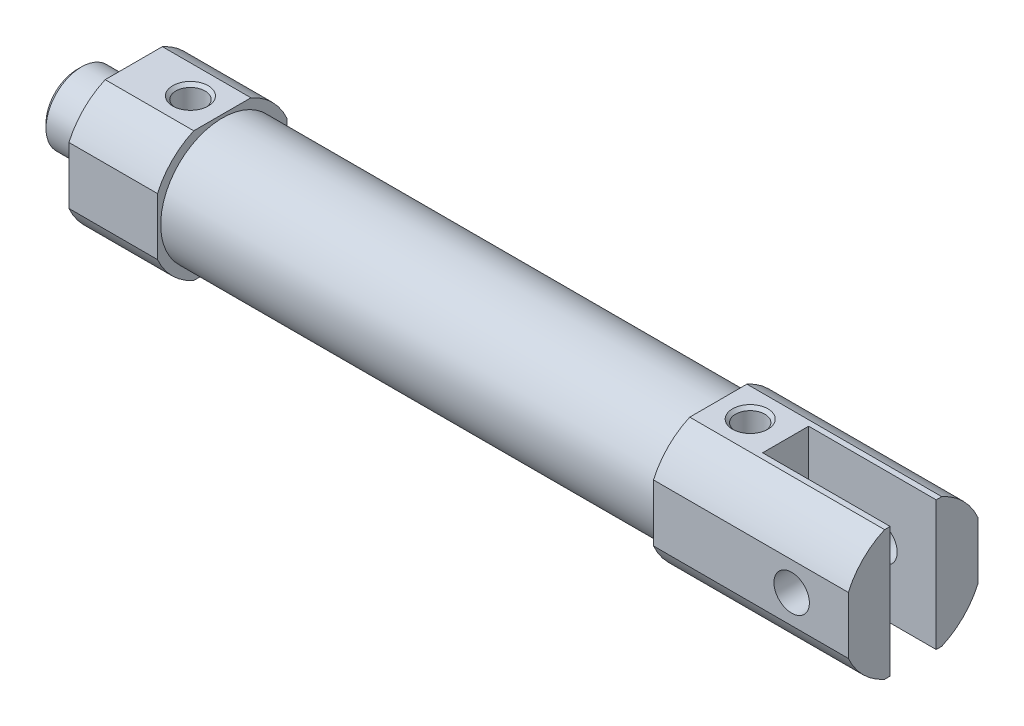
ISO-10303-21;
HEADER;
FILE_DESCRIPTION(('STEP AP214'),'2;1');
FILE_NAME('part.step','',(''),(''),'','','');
FILE_SCHEMA(('AUTOMOTIVE_DESIGN { 1 0 10303 214 1 1 1 1 }'));
ENDSEC;
DATA;
#1=APPLICATION_CONTEXT('core data for automotive mechanical design processes');
#2=APPLICATION_PROTOCOL_DEFINITION('international standard','automotive_design',2000,#1);
#3=PRODUCT_CONTEXT('',#1,'mechanical');
#4=PRODUCT('Part','Part','',(#3));
#5=PRODUCT_RELATED_PRODUCT_CATEGORY('part','',(#4));
#6=PRODUCT_DEFINITION_FORMATION('','',#4);
#7=PRODUCT_DEFINITION_CONTEXT('part definition',#1,'design');
#8=PRODUCT_DEFINITION('design','',#6,#7);
#9=PRODUCT_DEFINITION_SHAPE('','',#8);
#10=(LENGTH_UNIT() NAMED_UNIT(*) SI_UNIT(.MILLI.,.METRE.));
#11=(NAMED_UNIT(*) PLANE_ANGLE_UNIT() SI_UNIT($,.RADIAN.));
#12=(NAMED_UNIT(*) SI_UNIT($,.STERADIAN.) SOLID_ANGLE_UNIT());
#13=UNCERTAINTY_MEASURE_WITH_UNIT(LENGTH_MEASURE(1.E-05),#10,'distance_accuracy_value','');
#14=(GEOMETRIC_REPRESENTATION_CONTEXT(3) GLOBAL_UNCERTAINTY_ASSIGNED_CONTEXT((#13)) GLOBAL_UNIT_ASSIGNED_CONTEXT((#10,
#11,#12)) REPRESENTATION_CONTEXT('',''));
#15=CARTESIAN_POINT('',(0.,0.,0.));
#16=DIRECTION('',(0.,0.,1.));
#17=DIRECTION('',(1.,0.,0.));
#18=AXIS2_PLACEMENT_3D('',#15,#16,#17);
#19=CARTESIAN_POINT('',(82.5,-9.15,-4.0345383874738));
#20=DIRECTION('',(0.,-1.,0.));
#21=DIRECTION('',(1.,0.,0.));
#22=AXIS2_PLACEMENT_3D('',#19,#20,#21);
#23=PLANE('',#22);
#24=DIRECTION('',(1.,0.,0.));
#25=VECTOR('',#24,1.);
#26=CARTESIAN_POINT('',(92.,-9.15,3.25));
#27=LINE('',#26,#25);
#28=CARTESIAN_POINT('',(92.,-9.15,3.25));
#29=VERTEX_POINT('',#28);
#30=CARTESIAN_POINT('',(110.,-9.15,3.25));
#31=VERTEX_POINT('',#30);
#32=EDGE_CURVE('E157',#29,#31,#27,.T.);
#33=ORIENTED_EDGE('',*,*,#32,.T.);
#34=DIRECTION('',(0.,0.,1.));
#35=VECTOR('',#34,1.);
#36=CARTESIAN_POINT('',(110.,-9.15,3.25));
#37=LINE('',#36,#35);
#38=CARTESIAN_POINT('',(110.,-9.15,4.03453838747381));
#39=VERTEX_POINT('',#38);
#40=EDGE_CURVE('E172',#39,#31,#37,.F.);
#41=ORIENTED_EDGE('',*,*,#40,.F.);
#42=DIRECTION('',(-1.,0.,0.));
#43=VECTOR('',#42,1.);
#44=CARTESIAN_POINT('',(110.,-9.15,4.03453838747381));
#45=LINE('',#44,#43);
#46=CARTESIAN_POINT('',(82.5,-9.15,4.03453838747381));
#47=VERTEX_POINT('',#46);
#48=EDGE_CURVE('E181',#39,#47,#45,.T.);
#49=ORIENTED_EDGE('',*,*,#48,.T.);
#50=DIRECTION('',(0.,0.,-1.));
#51=VECTOR('',#50,1.);
#52=CARTESIAN_POINT('',(82.5,-9.15,4.03453838747381));
#53=LINE('',#52,#51);
#54=CARTESIAN_POINT('',(82.5,-9.15,-4.0345383874738));
#55=VERTEX_POINT('',#54);
#56=EDGE_CURVE('E183',#47,#55,#53,.T.);
#57=ORIENTED_EDGE('',*,*,#56,.T.);
#58=DIRECTION('',(1.,0.,0.));
#59=VECTOR('',#58,1.);
#60=CARTESIAN_POINT('',(82.5,-9.15,-4.0345383874738));
#61=LINE('',#60,#59);
#62=CARTESIAN_POINT('',(110.,-9.15,-4.0345383874738));
#63=VERTEX_POINT('',#62);
#64=EDGE_CURVE('E194',#63,#55,#61,.F.);
#65=ORIENTED_EDGE('',*,*,#64,.F.);
#66=DIRECTION('',(0.,0.,1.));
#67=VECTOR('',#66,1.);
#68=CARTESIAN_POINT('',(110.,-9.15,-4.0345383874738));
#69=LINE('',#68,#67);
#70=CARTESIAN_POINT('',(110.,-9.15,-3.25));
#71=VERTEX_POINT('',#70);
#72=EDGE_CURVE('E199',#71,#63,#69,.F.);
#73=ORIENTED_EDGE('',*,*,#72,.F.);
#74=DIRECTION('',(-1.,0.,0.));
#75=VECTOR('',#74,1.);
#76=CARTESIAN_POINT('',(110.,-9.15,-3.25));
#77=LINE('',#76,#75);
#78=CARTESIAN_POINT('',(92.,-9.15,-3.25));
#79=VERTEX_POINT('',#78);
#80=EDGE_CURVE('E204',#71,#79,#77,.T.);
#81=ORIENTED_EDGE('',*,*,#80,.T.);
#82=DIRECTION('',(0.,0.,1.));
#83=VECTOR('',#82,1.);
#84=CARTESIAN_POINT('',(92.,-9.15,-3.25));
#85=LINE('',#84,#83);
#86=EDGE_CURVE('E175',#79,#29,#85,.T.);
#87=ORIENTED_EDGE('',*,*,#86,.T.);
#88=EDGE_LOOP('',(#33,#41,#49,#57,#65,#73,#81,#87));
#89=FACE_BOUND('',#88,.T.);
#90=ADVANCED_FACE('F17',(#89),#23,.T.);
#91=CARTESIAN_POINT('',(82.5,9.15,4.0345383874738));
#92=DIRECTION('',(0.,1.,0.));
#93=DIRECTION('',(1.,0.,0.));
#94=AXIS2_PLACEMENT_3D('',#91,#92,#93);
#95=PLANE('',#94);
#96=DIRECTION('',(-1.,0.,0.));
#97=VECTOR('',#96,1.);
#98=CARTESIAN_POINT('',(110.,9.15,3.25));
#99=LINE('',#98,#97);
#100=CARTESIAN_POINT('',(92.,9.15,3.25));
#101=VERTEX_POINT('',#100);
#102=CARTESIAN_POINT('',(110.,9.15,3.25));
#103=VERTEX_POINT('',#102);
#104=EDGE_CURVE('E160',#101,#103,#99,.F.);
#105=ORIENTED_EDGE('',*,*,#104,.F.);
#106=DIRECTION('',(0.,0.,-1.));
#107=VECTOR('',#106,1.);
#108=CARTESIAN_POINT('',(92.,9.15,3.25));
#109=LINE('',#108,#107);
#110=CARTESIAN_POINT('',(92.,9.15,-3.25));
#111=VERTEX_POINT('',#110);
#112=EDGE_CURVE('E214',#111,#101,#109,.F.);
#113=ORIENTED_EDGE('',*,*,#112,.F.);
#114=DIRECTION('',(1.,0.,0.));
#115=VECTOR('',#114,1.);
#116=CARTESIAN_POINT('',(92.,9.15,-3.25));
#117=LINE('',#116,#115);
#118=CARTESIAN_POINT('',(110.,9.15,-3.25));
#119=VERTEX_POINT('',#118);
#120=EDGE_CURVE('E219',#119,#111,#117,.F.);
#121=ORIENTED_EDGE('',*,*,#120,.F.);
#122=DIRECTION('',(0.,0.,-1.));
#123=VECTOR('',#122,1.);
#124=CARTESIAN_POINT('',(110.,9.15,-3.25));
#125=LINE('',#124,#123);
#126=CARTESIAN_POINT('',(110.,9.15,-4.0345383874738));
#127=VERTEX_POINT('',#126);
#128=EDGE_CURVE('E223',#127,#119,#125,.F.);
#129=ORIENTED_EDGE('',*,*,#128,.F.);
#130=DIRECTION('',(-1.,0.,0.));
#131=VECTOR('',#130,1.);
#132=CARTESIAN_POINT('',(110.,9.15,-4.0345383874738));
#133=LINE('',#132,#131);
#134=CARTESIAN_POINT('',(82.5,9.15,-4.0345383874738));
#135=VERTEX_POINT('',#134);
#136=EDGE_CURVE('E228',#127,#135,#133,.T.);
#137=ORIENTED_EDGE('',*,*,#136,.T.);
#138=DIRECTION('',(0.,0.,1.));
#139=VECTOR('',#138,1.);
#140=CARTESIAN_POINT('',(82.5,9.15,-4.0345383874738));
#141=LINE('',#140,#139);
#142=CARTESIAN_POINT('',(82.5,9.15,4.0345383874738));
#143=VERTEX_POINT('',#142);
#144=EDGE_CURVE('E233',#135,#143,#141,.T.);
#145=ORIENTED_EDGE('',*,*,#144,.T.);
#146=DIRECTION('',(1.,0.,0.));
#147=VECTOR('',#146,1.);
#148=CARTESIAN_POINT('',(82.5,9.15,4.0345383874738));
#149=LINE('',#148,#147);
#150=CARTESIAN_POINT('',(110.,9.15,4.0345383874738));
#151=VERTEX_POINT('',#150);
#152=EDGE_CURVE('E238',#151,#143,#149,.F.);
#153=ORIENTED_EDGE('',*,*,#152,.F.);
#154=DIRECTION('',(0.,0.,-1.));
#155=VECTOR('',#154,1.);
#156=CARTESIAN_POINT('',(110.,9.15,4.0345383874738));
#157=LINE('',#156,#155);
#158=EDGE_CURVE('E243',#103,#151,#157,.F.);
#159=ORIENTED_EDGE('',*,*,#158,.F.);
#160=EDGE_LOOP('',(#105,#113,#121,#129,#137,#145,#153,#159));
#161=FACE_BOUND('',#160,.T.);
#162=CARTESIAN_POINT('',(87.,9.15,0.));
#163=DIRECTION('',(0.,-1.,0.));
#164=DIRECTION('',(0.,0.,1.));
#165=AXIS2_PLACEMENT_3D('',#162,#163,#164);
#166=CIRCLE('',#165,2.5);
#167=CARTESIAN_POINT('',(87.,9.15,2.5));
#168=VERTEX_POINT('',#167);
#169=EDGE_CURVE('E166',#168,#168,#166,.F.);
#170=ORIENTED_EDGE('',*,*,#169,.F.);
#171=EDGE_LOOP('',(#170));
#172=FACE_BOUND('',#171,.T.);
#173=ADVANCED_FACE('F522',(#161,#172),#95,.T.);
#174=CARTESIAN_POINT('',(110.,-9.15,9.15000000000001));
#175=DIRECTION('',(1.,0.,0.));
#176=DIRECTION('',(0.,0.,-1.));
#177=AXIS2_PLACEMENT_3D('',#174,#175,#176);
#178=PLANE('',#177);
#179=ORIENTED_EDGE('',*,*,#40,.T.);
#180=DIRECTION('',(0.,1.,0.));
#181=VECTOR('',#180,1.);
#182=CARTESIAN_POINT('',(110.,-9.15,3.25));
#183=LINE('',#182,#181);
#184=EDGE_CURVE('E153',#103,#31,#183,.F.);
#185=ORIENTED_EDGE('',*,*,#184,.F.);
#186=ORIENTED_EDGE('',*,*,#158,.T.);
#187=CARTESIAN_POINT('',(110.,5.30825383648903E-13,5.31692745386891E-13));
#188=DIRECTION('',(1.,0.,0.));
#189=DIRECTION('',(0.,0.915000000000012,0.403453838747356));
#190=AXIS2_PLACEMENT_3D('',#187,#188,#189);
#191=CIRCLE('',#190,9.99999999999929);
#192=CARTESIAN_POINT('',(110.,4.0345383874738,9.15000000000001));
#193=VERTEX_POINT('',#192);
#194=EDGE_CURVE('E165',#151,#193,#191,.T.);
#195=ORIENTED_EDGE('',*,*,#194,.T.);
#196=DIRECTION('',(0.,-1.,0.));
#197=VECTOR('',#196,1.);
#198=CARTESIAN_POINT('',(110.,4.0345383874738,9.15));
#199=LINE('',#198,#197);
#200=CARTESIAN_POINT('',(110.,-4.0345383874738,9.15000000000001));
#201=VERTEX_POINT('',#200);
#202=EDGE_CURVE('E255',#193,#201,#199,.T.);
#203=ORIENTED_EDGE('',*,*,#202,.T.);
#204=CARTESIAN_POINT('',(110.,-5.31692745386891E-13,5.30825383648903E-13));
#205=DIRECTION('',(1.,0.,0.));
#206=DIRECTION('',(0.,-0.403453838747355,0.915000000000013));
#207=AXIS2_PLACEMENT_3D('',#204,#205,#206);
#208=CIRCLE('',#207,9.99999999999929);
#209=EDGE_CURVE('E180',#201,#39,#208,.T.);
#210=ORIENTED_EDGE('',*,*,#209,.T.);
#211=EDGE_LOOP('',(#179,#185,#186,#195,#203,#210));
#212=FACE_BOUND('',#211,.T.);
#213=ADVANCED_FACE('F178',(#212),#178,.T.);
#214=CARTESIAN_POINT('',(110.,-9.15000000000001,-3.25));
#215=DIRECTION('',(1.,0.,0.));
#216=DIRECTION('',(0.,0.,-1.));
#217=AXIS2_PLACEMENT_3D('',#214,#215,#216);
#218=PLANE('',#217);
#219=ORIENTED_EDGE('',*,*,#128,.T.);
#220=DIRECTION('',(0.,-1.,0.));
#221=VECTOR('',#220,1.);
#222=CARTESIAN_POINT('',(110.,9.15,-3.25));
#223=LINE('',#222,#221);
#224=EDGE_CURVE('E262',#119,#71,#223,.T.);
#225=ORIENTED_EDGE('',*,*,#224,.T.);
#226=ORIENTED_EDGE('',*,*,#72,.T.);
#227=CARTESIAN_POINT('',(110.,-5.30825383648903E-13,-5.31692745386891E-13));
#228=DIRECTION('',(1.,0.,0.));
#229=DIRECTION('',(0.,-0.915000000000013,-0.403453838747355));
#230=AXIS2_PLACEMENT_3D('',#227,#228,#229);
#231=CIRCLE('',#230,9.99999999999929);
#232=CARTESIAN_POINT('',(110.,-4.03453838747381,-9.15));
#233=VERTEX_POINT('',#232);
#234=EDGE_CURVE('E267',#63,#233,#231,.T.);
#235=ORIENTED_EDGE('',*,*,#234,.T.);
#236=DIRECTION('',(0.,1.,0.));
#237=VECTOR('',#236,1.);
#238=CARTESIAN_POINT('',(110.,-4.03453838747381,-9.15));
#239=LINE('',#238,#237);
#240=CARTESIAN_POINT('',(110.,4.0345383874738,-9.15000000000001));
#241=VERTEX_POINT('',#240);
#242=EDGE_CURVE('E272',#233,#241,#239,.T.);
#243=ORIENTED_EDGE('',*,*,#242,.T.);
#244=CARTESIAN_POINT('',(110.,5.31692745386891E-13,-5.30825383648903E-13));
#245=DIRECTION('',(1.,0.,0.));
#246=DIRECTION('',(0.,0.403453838747355,-0.915000000000012));
#247=AXIS2_PLACEMENT_3D('',#244,#245,#246);
#248=CIRCLE('',#247,9.99999999999929);
#249=EDGE_CURVE('E277',#241,#127,#248,.T.);
#250=ORIENTED_EDGE('',*,*,#249,.T.);
#251=EDGE_LOOP('',(#219,#225,#226,#235,#243,#250));
#252=FACE_BOUND('',#251,.T.);
#253=ADVANCED_FACE('F532',(#252),#218,.T.);
#254=CARTESIAN_POINT('',(-8.,-4.3865,4.3865));
#255=DIRECTION('',(-1.,0.,0.));
#256=DIRECTION('',(0.,1.,0.));
#257=AXIS2_PLACEMENT_3D('',#254,#255,#256);
#258=PLANE('',#257);
#259=CARTESIAN_POINT('',(-8.,0.,0.));
#260=DIRECTION('',(-1.,0.,0.));
#261=DIRECTION('',(0.,0.,-1.));
#262=AXIS2_PLACEMENT_3D('',#259,#260,#261);
#263=CIRCLE('',#262,4.3865);
#264=CARTESIAN_POINT('',(-8.,0.,-4.3865));
#265=VERTEX_POINT('',#264);
#266=EDGE_CURVE('E282',#265,#265,#263,.F.);
#267=ORIENTED_EDGE('',*,*,#266,.F.);
#268=EDGE_LOOP('',(#267));
#269=FACE_BOUND('',#268,.T.);
#270=CARTESIAN_POINT('',(-8.,0.,0.));
#271=DIRECTION('',(1.,0.,0.));
#272=DIRECTION('',(0.,-1.420539007313E-07,0.99999999999999));
#273=AXIS2_PLACEMENT_3D('',#270,#271,#272);
#274=CIRCLE('',#273,2.5);
#275=CARTESIAN_POINT('',(-8.,-3.55134751828251E-07,2.49999999999997));
#276=VERTEX_POINT('',#275);
#277=EDGE_CURVE('E287',#276,#276,#274,.T.);
#278=ORIENTED_EDGE('',*,*,#277,.T.);
#279=EDGE_LOOP('',(#278));
#280=FACE_BOUND('',#279,.T.);
#281=ADVANCED_FACE('F535',(#269,#280),#258,.T.);
#282=CARTESIAN_POINT('',(12.5,5.30825383648903E-13,5.31692745386891E-13));
#283=DIRECTION('',(-1.,0.,0.));
#284=DIRECTION('',(0.,0.403453838747356,0.915000000000012));
#285=AXIS2_PLACEMENT_3D('',#282,#283,#284);
#286=CYLINDRICAL_SURFACE('',#285,9.99999999999929);
#287=CARTESIAN_POINT('',(0.,5.30825383648903E-13,5.31692745386891E-13));
#288=DIRECTION('',(1.,0.,0.));
#289=DIRECTION('',(0.,0.915000000000012,0.403453838747356));
#290=AXIS2_PLACEMENT_3D('',#287,#288,#289);
#291=CIRCLE('',#290,9.99999999999929);
#292=CARTESIAN_POINT('',(0.,9.15000000000001,4.0345383874738));
#293=VERTEX_POINT('',#292);
#294=CARTESIAN_POINT('',(0.,4.03453838747381,9.15000000000001));
#295=VERTEX_POINT('',#294);
#296=EDGE_CURVE('E290',#293,#295,#291,.T.);
#297=ORIENTED_EDGE('',*,*,#296,.T.);
#298=DIRECTION('',(1.,0.,0.));
#299=VECTOR('',#298,1.);
#300=CARTESIAN_POINT('',(0.,4.03453838747381,9.15000000000001));
#301=LINE('',#300,#299);
#302=CARTESIAN_POINT('',(12.5,4.03453838747381,9.15000000000001));
#303=VERTEX_POINT('',#302);
#304=EDGE_CURVE('E293',#303,#295,#301,.F.);
#305=ORIENTED_EDGE('',*,*,#304,.F.);
#306=CARTESIAN_POINT('',(12.5,5.30825383648903E-13,5.31692745386891E-13));
#307=DIRECTION('',(-1.,0.,0.));
#308=DIRECTION('',(0.,0.403453838747356,0.915000000000012));
#309=AXIS2_PLACEMENT_3D('',#306,#307,#308);
#310=CIRCLE('',#309,9.99999999999929);
#311=CARTESIAN_POINT('',(12.5,9.15000000000001,4.0345383874738));
#312=VERTEX_POINT('',#311);
#313=EDGE_CURVE('E298',#312,#303,#310,.F.);
#314=ORIENTED_EDGE('',*,*,#313,.F.);
#315=DIRECTION('',(-1.,0.,0.));
#316=VECTOR('',#315,1.);
#317=CARTESIAN_POINT('',(12.5,9.15000000000001,4.0345383874738));
#318=LINE('',#317,#316);
#319=EDGE_CURVE('E302',#312,#293,#318,.T.);
#320=ORIENTED_EDGE('',*,*,#319,.T.);
#321=EDGE_LOOP('',(#297,#305,#314,#320));
#322=FACE_BOUND('',#321,.T.);
#323=ADVANCED_FACE('F539',(#322),#286,.T.);
#324=CARTESIAN_POINT('',(12.5,-4.0345383874738,9.15));
#325=DIRECTION('',(0.,0.,1.));
#326=DIRECTION('',(0.,1.,0.));
#327=AXIS2_PLACEMENT_3D('',#324,#325,#326);
#328=PLANE('',#327);
#329=DIRECTION('',(0.,-1.,0.));
#330=VECTOR('',#329,1.);
#331=CARTESIAN_POINT('',(0.,4.0345383874738,9.15));
#332=LINE('',#331,#330);
#333=CARTESIAN_POINT('',(0.,-4.0345383874738,9.15));
#334=VERTEX_POINT('',#333);
#335=EDGE_CURVE('E307',#295,#334,#332,.T.);
#336=ORIENTED_EDGE('',*,*,#335,.T.);
#337=DIRECTION('',(1.,0.,0.));
#338=VECTOR('',#337,1.);
#339=CARTESIAN_POINT('',(0.,-4.0345383874738,9.15));
#340=LINE('',#339,#338);
#341=CARTESIAN_POINT('',(12.5,-4.0345383874738,9.15));
#342=VERTEX_POINT('',#341);
#343=EDGE_CURVE('E312',#342,#334,#340,.F.);
#344=ORIENTED_EDGE('',*,*,#343,.F.);
#345=DIRECTION('',(0.,1.,0.));
#346=VECTOR('',#345,1.);
#347=CARTESIAN_POINT('',(12.5,-4.0345383874738,9.15));
#348=LINE('',#347,#346);
#349=EDGE_CURVE('E317',#303,#342,#348,.F.);
#350=ORIENTED_EDGE('',*,*,#349,.F.);
#351=ORIENTED_EDGE('',*,*,#304,.T.);
#352=EDGE_LOOP('',(#336,#344,#350,#351));
#353=FACE_BOUND('',#352,.T.);
#354=ADVANCED_FACE('F543',(#353),#328,.T.);
#355=CARTESIAN_POINT('',(12.5,-5.31692745386891E-13,5.30825383648903E-13));
#356=DIRECTION('',(-1.,0.,0.));
#357=DIRECTION('',(0.,-0.915000000000013,0.403453838747355));
#358=AXIS2_PLACEMENT_3D('',#355,#356,#357);
#359=CYLINDRICAL_SURFACE('',#358,9.99999999999929);
#360=CARTESIAN_POINT('',(0.,-5.31692745386891E-13,5.30825383648903E-13));
#361=DIRECTION('',(1.,0.,0.));
#362=DIRECTION('',(0.,-0.403453838747356,0.915000000000012));
#363=AXIS2_PLACEMENT_3D('',#360,#361,#362);
#364=CIRCLE('',#363,9.99999999999929);
#365=CARTESIAN_POINT('',(0.,-9.15000000000001,4.0345383874738));
#366=VERTEX_POINT('',#365);
#367=EDGE_CURVE('E321',#334,#366,#364,.T.);
#368=ORIENTED_EDGE('',*,*,#367,.T.);
#369=DIRECTION('',(1.,0.,0.));
#370=VECTOR('',#369,1.);
#371=CARTESIAN_POINT('',(0.,-9.15000000000001,4.03453838747381));
#372=LINE('',#371,#370);
#373=CARTESIAN_POINT('',(12.5,-9.15000000000001,4.03453838747381));
#374=VERTEX_POINT('',#373);
#375=EDGE_CURVE('E326',#374,#366,#372,.F.);
#376=ORIENTED_EDGE('',*,*,#375,.F.);
#377=CARTESIAN_POINT('',(12.5,-5.31692745386891E-13,5.30825383648903E-13));
#378=DIRECTION('',(-1.,0.,0.));
#379=DIRECTION('',(0.,-0.915000000000012,0.403453838747357));
#380=AXIS2_PLACEMENT_3D('',#377,#378,#379);
#381=CIRCLE('',#380,9.99999999999929);
#382=EDGE_CURVE('E331',#342,#374,#381,.F.);
#383=ORIENTED_EDGE('',*,*,#382,.F.);
#384=ORIENTED_EDGE('',*,*,#343,.T.);
#385=EDGE_LOOP('',(#368,#376,#383,#384));
#386=FACE_BOUND('',#385,.T.);
#387=ADVANCED_FACE('F547',(#386),#359,.T.);
#388=CARTESIAN_POINT('',(0.,-9.15,-4.0345383874738));
#389=DIRECTION('',(0.,-1.,0.));
#390=DIRECTION('',(1.,0.,0.));
#391=AXIS2_PLACEMENT_3D('',#388,#389,#390);
#392=PLANE('',#391);
#393=DIRECTION('',(0.,0.,-1.));
#394=VECTOR('',#393,1.);
#395=CARTESIAN_POINT('',(0.,-9.15,4.03453838747381));
#396=LINE('',#395,#394);
#397=CARTESIAN_POINT('',(0.,-9.15,-4.0345383874738));
#398=VERTEX_POINT('',#397);
#399=EDGE_CURVE('E335',#366,#398,#396,.T.);
#400=ORIENTED_EDGE('',*,*,#399,.T.);
#401=DIRECTION('',(1.,0.,0.));
#402=VECTOR('',#401,1.);
#403=CARTESIAN_POINT('',(0.,-9.15,-4.0345383874738));
#404=LINE('',#403,#402);
#405=CARTESIAN_POINT('',(12.5,-9.15,-4.0345383874738));
#406=VERTEX_POINT('',#405);
#407=EDGE_CURVE('E340',#406,#398,#404,.F.);
#408=ORIENTED_EDGE('',*,*,#407,.F.);
#409=DIRECTION('',(0.,0.,1.));
#410=VECTOR('',#409,1.);
#411=CARTESIAN_POINT('',(12.5,-9.15,-4.0345383874738));
#412=LINE('',#411,#410);
#413=EDGE_CURVE('E345',#374,#406,#412,.F.);
#414=ORIENTED_EDGE('',*,*,#413,.F.);
#415=ORIENTED_EDGE('',*,*,#375,.T.);
#416=EDGE_LOOP('',(#400,#408,#414,#415));
#417=FACE_BOUND('',#416,.T.);
#418=ADVANCED_FACE('F551',(#417),#392,.T.);
#419=CARTESIAN_POINT('',(12.5,-5.30825383648903E-13,-5.31692745386891E-13));
#420=DIRECTION('',(-1.,0.,0.));
#421=DIRECTION('',(0.,-0.403453838747356,-0.915000000000012));
#422=AXIS2_PLACEMENT_3D('',#419,#420,#421);
#423=CYLINDRICAL_SURFACE('',#422,9.99999999999929);
#424=CARTESIAN_POINT('',(0.,-5.30825383648903E-13,-5.31692745386891E-13));
#425=DIRECTION('',(1.,0.,0.));
#426=DIRECTION('',(0.,-0.915000000000012,-0.403453838747356));
#427=AXIS2_PLACEMENT_3D('',#424,#425,#426);
#428=CIRCLE('',#427,9.99999999999929);
#429=CARTESIAN_POINT('',(0.,-4.03453838747381,-9.15000000000001));
#430=VERTEX_POINT('',#429);
#431=EDGE_CURVE('E349',#398,#430,#428,.T.);
#432=ORIENTED_EDGE('',*,*,#431,.T.);
#433=DIRECTION('',(1.,0.,0.));
#434=VECTOR('',#433,1.);
#435=CARTESIAN_POINT('',(0.,-4.03453838747381,-9.15));
#436=LINE('',#435,#434);
#437=CARTESIAN_POINT('',(12.5,-4.03453838747381,-9.15));
#438=VERTEX_POINT('',#437);
#439=EDGE_CURVE('E354',#438,#430,#436,.F.);
#440=ORIENTED_EDGE('',*,*,#439,.F.);
#441=CARTESIAN_POINT('',(12.5,-5.30825383648903E-13,-5.31692745386891E-13));
#442=DIRECTION('',(-1.,0.,0.));
#443=DIRECTION('',(0.,-0.403453838747356,-0.915000000000012));
#444=AXIS2_PLACEMENT_3D('',#441,#442,#443);
#445=CIRCLE('',#444,9.99999999999929);
#446=EDGE_CURVE('E359',#406,#438,#445,.F.);
#447=ORIENTED_EDGE('',*,*,#446,.F.);
#448=ORIENTED_EDGE('',*,*,#407,.T.);
#449=EDGE_LOOP('',(#432,#440,#447,#448));
#450=FACE_BOUND('',#449,.T.);
#451=ADVANCED_FACE('F555',(#450),#423,.T.);
#452=CARTESIAN_POINT('',(0.,-4.03453838747381,-9.15));
#453=DIRECTION('',(0.,0.,-1.));
#454=DIRECTION('',(0.,1.,0.));
#455=AXIS2_PLACEMENT_3D('',#452,#453,#454);
#456=PLANE('',#455);
#457=DIRECTION('',(0.,1.,0.));
#458=VECTOR('',#457,1.);
#459=CARTESIAN_POINT('',(0.,-4.03453838747381,-9.15));
#460=LINE('',#459,#458);
#461=CARTESIAN_POINT('',(0.,4.0345383874738,-9.15));
#462=VERTEX_POINT('',#461);
#463=EDGE_CURVE('E363',#430,#462,#460,.T.);
#464=ORIENTED_EDGE('',*,*,#463,.T.);
#465=DIRECTION('',(1.,0.,0.));
#466=VECTOR('',#465,1.);
#467=CARTESIAN_POINT('',(0.,4.0345383874738,-9.15));
#468=LINE('',#467,#466);
#469=CARTESIAN_POINT('',(12.5,4.0345383874738,-9.15));
#470=VERTEX_POINT('',#469);
#471=EDGE_CURVE('E368',#470,#462,#468,.F.);
#472=ORIENTED_EDGE('',*,*,#471,.F.);
#473=DIRECTION('',(0.,-1.,0.));
#474=VECTOR('',#473,1.);
#475=CARTESIAN_POINT('',(12.5,4.0345383874738,-9.15));
#476=LINE('',#475,#474);
#477=EDGE_CURVE('E373',#438,#470,#476,.F.);
#478=ORIENTED_EDGE('',*,*,#477,.F.);
#479=ORIENTED_EDGE('',*,*,#439,.T.);
#480=EDGE_LOOP('',(#464,#472,#478,#479));
#481=FACE_BOUND('',#480,.T.);
#482=ADVANCED_FACE('F559',(#481),#456,.T.);
#483=CARTESIAN_POINT('',(12.5,5.31692745386891E-13,-5.30825383648903E-13));
#484=DIRECTION('',(-1.,0.,0.));
#485=DIRECTION('',(0.,0.915000000000012,-0.403453838747356));
#486=AXIS2_PLACEMENT_3D('',#483,#484,#485);
#487=CYLINDRICAL_SURFACE('',#486,9.99999999999929);
#488=CARTESIAN_POINT('',(0.,5.31692745386891E-13,-5.30825383648903E-13));
#489=DIRECTION('',(1.,0.,0.));
#490=DIRECTION('',(0.,0.403453838747356,-0.915000000000012));
#491=AXIS2_PLACEMENT_3D('',#488,#489,#490);
#492=CIRCLE('',#491,9.99999999999929);
#493=CARTESIAN_POINT('',(0.,9.15000000000001,-4.03453838747381));
#494=VERTEX_POINT('',#493);
#495=EDGE_CURVE('E377',#462,#494,#492,.T.);
#496=ORIENTED_EDGE('',*,*,#495,.T.);
#497=DIRECTION('',(1.,0.,0.));
#498=VECTOR('',#497,1.);
#499=CARTESIAN_POINT('',(0.,9.15,-4.03453838747381));
#500=LINE('',#499,#498);
#501=CARTESIAN_POINT('',(12.5,9.15,-4.03453838747381));
#502=VERTEX_POINT('',#501);
#503=EDGE_CURVE('E382',#502,#494,#500,.F.);
#504=ORIENTED_EDGE('',*,*,#503,.F.);
#505=CARTESIAN_POINT('',(12.5,5.31692745386891E-13,-5.30825383648903E-13));
#506=DIRECTION('',(-1.,0.,0.));
#507=DIRECTION('',(0.,0.915000000000012,-0.403453838747356));
#508=AXIS2_PLACEMENT_3D('',#505,#506,#507);
#509=CIRCLE('',#508,9.99999999999929);
#510=EDGE_CURVE('E387',#470,#502,#509,.F.);
#511=ORIENTED_EDGE('',*,*,#510,.F.);
#512=ORIENTED_EDGE('',*,*,#471,.T.);
#513=EDGE_LOOP('',(#496,#504,#511,#512));
#514=FACE_BOUND('',#513,.T.);
#515=ADVANCED_FACE('F563',(#514),#487,.T.);
#516=CARTESIAN_POINT('',(0.,9.15,4.0345383874738));
#517=DIRECTION('',(0.,1.,0.));
#518=DIRECTION('',(1.,0.,0.));
#519=AXIS2_PLACEMENT_3D('',#516,#517,#518);
#520=PLANE('',#519);
#521=DIRECTION('',(0.,0.,1.));
#522=VECTOR('',#521,1.);
#523=CARTESIAN_POINT('',(0.,9.15,-4.0345383874738));
#524=LINE('',#523,#522);
#525=EDGE_CURVE('E391',#494,#293,#524,.T.);
#526=ORIENTED_EDGE('',*,*,#525,.T.);
#527=ORIENTED_EDGE('',*,*,#319,.F.);
#528=DIRECTION('',(0.,0.,-1.));
#529=VECTOR('',#528,1.);
#530=CARTESIAN_POINT('',(12.5,9.15,4.0345383874738));
#531=LINE('',#530,#529);
#532=EDGE_CURVE('E396',#502,#312,#531,.F.);
#533=ORIENTED_EDGE('',*,*,#532,.F.);
#534=ORIENTED_EDGE('',*,*,#503,.T.);
#535=EDGE_LOOP('',(#526,#527,#533,#534));
#536=FACE_BOUND('',#535,.T.);
#537=CARTESIAN_POINT('',(8.,9.15,0.));
#538=DIRECTION('',(0.,-1.,0.));
#539=DIRECTION('',(0.,0.,1.));
#540=AXIS2_PLACEMENT_3D('',#537,#538,#539);
#541=CIRCLE('',#540,2.5);
#542=CARTESIAN_POINT('',(8.,9.15,2.5));
#543=VERTEX_POINT('',#542);
#544=EDGE_CURVE('E400',#543,#543,#541,.F.);
#545=ORIENTED_EDGE('',*,*,#544,.F.);
#546=EDGE_LOOP('',(#545));
#547=FACE_BOUND('',#546,.T.);
#548=ADVANCED_FACE('F567',(#536,#547),#520,.T.);
#549=CARTESIAN_POINT('',(12.5,-9.15000000000001,9.15000000000001));
#550=DIRECTION('',(1.,0.,0.));
#551=DIRECTION('',(0.,0.,-1.));
#552=AXIS2_PLACEMENT_3D('',#549,#550,#551);
#553=PLANE('',#552);
#554=ORIENTED_EDGE('',*,*,#313,.T.);
#555=ORIENTED_EDGE('',*,*,#349,.T.);
#556=ORIENTED_EDGE('',*,*,#382,.T.);
#557=ORIENTED_EDGE('',*,*,#413,.T.);
#558=ORIENTED_EDGE('',*,*,#446,.T.);
#559=ORIENTED_EDGE('',*,*,#477,.T.);
#560=ORIENTED_EDGE('',*,*,#510,.T.);
#561=ORIENTED_EDGE('',*,*,#532,.T.);
#562=EDGE_LOOP('',(#554,#555,#556,#557,#558,#559,#560,#561));
#563=FACE_BOUND('',#562,.T.);
#564=CARTESIAN_POINT('',(12.5,0.,0.));
#565=DIRECTION('',(-1.,0.,0.));
#566=DIRECTION('',(0.,-1.16844485555755E-09,-1.));
#567=AXIS2_PLACEMENT_3D('',#564,#565,#566);
#568=CIRCLE('',#567,8.7);
#569=CARTESIAN_POINT('',(12.5,-1.01654702433507E-08,-8.7));
#570=VERTEX_POINT('',#569);
#571=EDGE_CURVE('E405',#570,#570,#568,.F.);
#572=ORIENTED_EDGE('',*,*,#571,.F.);
#573=EDGE_LOOP('',(#572));
#574=FACE_BOUND('',#573,.T.);
#575=ADVANCED_FACE('F571',(#563,#574),#553,.T.);
#576=CARTESIAN_POINT('',(0.,-9.15000000000001,9.15000000000001));
#577=DIRECTION('',(-1.,0.,0.));
#578=DIRECTION('',(0.,1.,0.));
#579=AXIS2_PLACEMENT_3D('',#576,#577,#578);
#580=PLANE('',#579);
#581=ORIENTED_EDGE('',*,*,#296,.F.);
#582=ORIENTED_EDGE('',*,*,#525,.F.);
#583=ORIENTED_EDGE('',*,*,#495,.F.);
#584=ORIENTED_EDGE('',*,*,#463,.F.);
#585=ORIENTED_EDGE('',*,*,#431,.F.);
#586=ORIENTED_EDGE('',*,*,#399,.F.);
#587=ORIENTED_EDGE('',*,*,#367,.F.);
#588=ORIENTED_EDGE('',*,*,#335,.F.);
#589=EDGE_LOOP('',(#581,#582,#583,#584,#585,#586,#587,#588));
#590=FACE_BOUND('',#589,.T.);
#591=CARTESIAN_POINT('',(0.,0.,0.));
#592=DIRECTION('',(1.,0.,0.));
#593=DIRECTION('',(0.,0.,1.));
#594=AXIS2_PLACEMENT_3D('',#591,#592,#593);
#595=CIRCLE('',#594,5.);
#596=CARTESIAN_POINT('',(0.,0.,5.));
#597=VERTEX_POINT('',#596);
#598=EDGE_CURVE('E408',#597,#597,#595,.T.);
#599=ORIENTED_EDGE('',*,*,#598,.T.);
#600=EDGE_LOOP('',(#599));
#601=FACE_BOUND('',#600,.T.);
#602=ADVANCED_FACE('F575',(#590,#601),#580,.T.);
#603=CARTESIAN_POINT('',(110.,5.30825383648903E-13,5.31692745386891E-13));
#604=DIRECTION('',(-1.,0.,0.));
#605=DIRECTION('',(0.,0.403453838747356,0.915000000000012));
#606=AXIS2_PLACEMENT_3D('',#603,#604,#605);
#607=CYLINDRICAL_SURFACE('',#606,9.99999999999929);
#608=CARTESIAN_POINT('',(82.5,5.30825383648903E-13,5.31692745386891E-13));
#609=DIRECTION('',(1.,0.,0.));
#610=DIRECTION('',(0.,0.915000000000012,0.403453838747356));
#611=AXIS2_PLACEMENT_3D('',#608,#609,#610);
#612=CIRCLE('',#611,9.99999999999929);
#613=CARTESIAN_POINT('',(82.5,4.03453838747381,9.15000000000001));
#614=VERTEX_POINT('',#613);
#615=EDGE_CURVE('E411',#143,#614,#612,.T.);
#616=ORIENTED_EDGE('',*,*,#615,.T.);
#617=DIRECTION('',(1.,0.,0.));
#618=VECTOR('',#617,1.);
#619=CARTESIAN_POINT('',(82.5,4.03453838747381,9.15000000000001));
#620=LINE('',#619,#618);
#621=EDGE_CURVE('E414',#193,#614,#620,.F.);
#622=ORIENTED_EDGE('',*,*,#621,.F.);
#623=ORIENTED_EDGE('',*,*,#194,.F.);
#624=ORIENTED_EDGE('',*,*,#152,.T.);
#625=EDGE_LOOP('',(#616,#622,#623,#624));
#626=FACE_BOUND('',#625,.T.);
#627=ADVANCED_FACE('F579',(#626),#607,.T.);
#628=CARTESIAN_POINT('',(110.,-4.0345383874738,9.15));
#629=DIRECTION('',(0.,0.,1.));
#630=DIRECTION('',(0.,1.,0.));
#631=AXIS2_PLACEMENT_3D('',#628,#629,#630);
#632=PLANE('',#631);
#633=DIRECTION('',(0.,-1.,0.));
#634=VECTOR('',#633,1.);
#635=CARTESIAN_POINT('',(82.5,4.0345383874738,9.15));
#636=LINE('',#635,#634);
#637=CARTESIAN_POINT('',(82.5,-4.0345383874738,9.15));
#638=VERTEX_POINT('',#637);
#639=EDGE_CURVE('E419',#614,#638,#636,.T.);
#640=ORIENTED_EDGE('',*,*,#639,.T.);
#641=DIRECTION('',(1.,0.,0.));
#642=VECTOR('',#641,1.);
#643=CARTESIAN_POINT('',(82.5,-4.0345383874738,9.15));
#644=LINE('',#643,#642);
#645=EDGE_CURVE('E424',#201,#638,#644,.F.);
#646=ORIENTED_EDGE('',*,*,#645,.F.);
#647=ORIENTED_EDGE('',*,*,#202,.F.);
#648=ORIENTED_EDGE('',*,*,#621,.T.);
#649=EDGE_LOOP('',(#640,#646,#647,#648));
#650=FACE_BOUND('',#649,.T.);
#651=CARTESIAN_POINT('',(102.,0.,9.15));
#652=DIRECTION('',(0.,0.,-1.));
#653=DIRECTION('',(1.,0.,0.));
#654=AXIS2_PLACEMENT_3D('',#651,#652,#653);
#655=CIRCLE('',#654,2.5);
#656=CARTESIAN_POINT('',(104.5,0.,9.15));
#657=VERTEX_POINT('',#656);
#658=EDGE_CURVE('E429',#657,#657,#655,.F.);
#659=ORIENTED_EDGE('',*,*,#658,.F.);
#660=EDGE_LOOP('',(#659));
#661=FACE_BOUND('',#660,.T.);
#662=ADVANCED_FACE('F583',(#650,#661),#632,.T.);
#663=CARTESIAN_POINT('',(110.,-5.31692745386891E-13,5.30825383648903E-13));
#664=DIRECTION('',(-1.,0.,0.));
#665=DIRECTION('',(0.,-0.915000000000013,0.403453838747355));
#666=AXIS2_PLACEMENT_3D('',#663,#664,#665);
#667=CYLINDRICAL_SURFACE('',#666,9.99999999999929);
#668=CARTESIAN_POINT('',(82.5,-5.31692745386891E-13,5.30825383648903E-13));
#669=DIRECTION('',(1.,0.,0.));
#670=DIRECTION('',(0.,-0.403453838747356,0.915000000000012));
#671=AXIS2_PLACEMENT_3D('',#668,#669,#670);
#672=CIRCLE('',#671,9.99999999999929);
#673=EDGE_CURVE('E434',#638,#47,#672,.T.);
#674=ORIENTED_EDGE('',*,*,#673,.T.);
#675=ORIENTED_EDGE('',*,*,#48,.F.);
#676=ORIENTED_EDGE('',*,*,#209,.F.);
#677=ORIENTED_EDGE('',*,*,#645,.T.);
#678=EDGE_LOOP('',(#674,#675,#676,#677));
#679=FACE_BOUND('',#678,.T.);
#680=ADVANCED_FACE('F587',(#679),#667,.T.);
#681=CARTESIAN_POINT('',(110.,-5.30825383648903E-13,-5.31692745386891E-13));
#682=DIRECTION('',(-1.,0.,0.));
#683=DIRECTION('',(0.,-0.403453838747356,-0.915000000000012));
#684=AXIS2_PLACEMENT_3D('',#681,#682,#683);
#685=CYLINDRICAL_SURFACE('',#684,9.99999999999929);
#686=CARTESIAN_POINT('',(82.5,-5.30825383648903E-13,-5.31692745386891E-13));
#687=DIRECTION('',(1.,0.,0.));
#688=DIRECTION('',(0.,-0.915000000000012,-0.403453838747356));
#689=AXIS2_PLACEMENT_3D('',#686,#687,#688);
#690=CIRCLE('',#689,9.99999999999929);
#691=CARTESIAN_POINT('',(82.5,-4.03453838747381,-9.15000000000001));
#692=VERTEX_POINT('',#691);
#693=EDGE_CURVE('E437',#55,#692,#690,.T.);
#694=ORIENTED_EDGE('',*,*,#693,.T.);
#695=DIRECTION('',(1.,0.,0.));
#696=VECTOR('',#695,1.);
#697=CARTESIAN_POINT('',(82.5,-4.03453838747381,-9.15));
#698=LINE('',#697,#696);
#699=EDGE_CURVE('E442',#233,#692,#698,.F.);
#700=ORIENTED_EDGE('',*,*,#699,.F.);
#701=ORIENTED_EDGE('',*,*,#234,.F.);
#702=ORIENTED_EDGE('',*,*,#64,.T.);
#703=EDGE_LOOP('',(#694,#700,#701,#702));
#704=FACE_BOUND('',#703,.T.);
#705=ADVANCED_FACE('F591',(#704),#685,.T.);
#706=CARTESIAN_POINT('',(82.5,-4.03453838747381,-9.15));
#707=DIRECTION('',(0.,0.,-1.));
#708=DIRECTION('',(0.,1.,0.));
#709=AXIS2_PLACEMENT_3D('',#706,#707,#708);
#710=PLANE('',#709);
#711=DIRECTION('',(0.,1.,0.));
#712=VECTOR('',#711,1.);
#713=CARTESIAN_POINT('',(82.5,-4.03453838747381,-9.15));
#714=LINE('',#713,#712);
#715=CARTESIAN_POINT('',(82.5,4.0345383874738,-9.15));
#716=VERTEX_POINT('',#715);
#717=EDGE_CURVE('E447',#692,#716,#714,.T.);
#718=ORIENTED_EDGE('',*,*,#717,.T.);
#719=DIRECTION('',(1.,0.,0.));
#720=VECTOR('',#719,1.);
#721=CARTESIAN_POINT('',(82.5,4.0345383874738,-9.15));
#722=LINE('',#721,#720);
#723=EDGE_CURVE('E452',#241,#716,#722,.F.);
#724=ORIENTED_EDGE('',*,*,#723,.F.);
#725=ORIENTED_EDGE('',*,*,#242,.F.);
#726=ORIENTED_EDGE('',*,*,#699,.T.);
#727=EDGE_LOOP('',(#718,#724,#725,#726));
#728=FACE_BOUND('',#727,.T.);
#729=CARTESIAN_POINT('',(102.,0.,-9.15));
#730=DIRECTION('',(0.,0.,1.));
#731=DIRECTION('',(-1.,0.,0.));
#732=AXIS2_PLACEMENT_3D('',#729,#730,#731);
#733=CIRCLE('',#732,2.5);
#734=CARTESIAN_POINT('',(99.5,0.,-9.15));
#735=VERTEX_POINT('',#734);
#736=EDGE_CURVE('E457',#735,#735,#733,.T.);
#737=ORIENTED_EDGE('',*,*,#736,.T.);
#738=EDGE_LOOP('',(#737));
#739=FACE_BOUND('',#738,.T.);
#740=ADVANCED_FACE('F595',(#728,#739),#710,.T.);
#741=CARTESIAN_POINT('',(110.,5.31692745386891E-13,-5.30825383648903E-13));
#742=DIRECTION('',(-1.,0.,0.));
#743=DIRECTION('',(0.,0.915000000000012,-0.403453838747356));
#744=AXIS2_PLACEMENT_3D('',#741,#742,#743);
#745=CYLINDRICAL_SURFACE('',#744,9.99999999999929);
#746=CARTESIAN_POINT('',(82.5,5.31692745386891E-13,-5.30825383648903E-13));
#747=DIRECTION('',(1.,0.,0.));
#748=DIRECTION('',(0.,0.403453838747356,-0.915000000000012));
#749=AXIS2_PLACEMENT_3D('',#746,#747,#748);
#750=CIRCLE('',#749,9.99999999999929);
#751=EDGE_CURVE('E462',#716,#135,#750,.T.);
#752=ORIENTED_EDGE('',*,*,#751,.T.);
#753=ORIENTED_EDGE('',*,*,#136,.F.);
#754=ORIENTED_EDGE('',*,*,#249,.F.);
#755=ORIENTED_EDGE('',*,*,#723,.T.);
#756=EDGE_LOOP('',(#752,#753,#754,#755));
#757=FACE_BOUND('',#756,.T.);
#758=ADVANCED_FACE('F599',(#757),#745,.T.);
#759=CARTESIAN_POINT('',(82.5,-9.15000000000001,9.15000000000001));
#760=DIRECTION('',(-1.,0.,0.));
#761=DIRECTION('',(0.,1.,0.));
#762=AXIS2_PLACEMENT_3D('',#759,#760,#761);
#763=PLANE('',#762);
#764=ORIENTED_EDGE('',*,*,#615,.F.);
#765=ORIENTED_EDGE('',*,*,#144,.F.);
#766=ORIENTED_EDGE('',*,*,#751,.F.);
#767=ORIENTED_EDGE('',*,*,#717,.F.);
#768=ORIENTED_EDGE('',*,*,#693,.F.);
#769=ORIENTED_EDGE('',*,*,#56,.F.);
#770=ORIENTED_EDGE('',*,*,#673,.F.);
#771=ORIENTED_EDGE('',*,*,#639,.F.);
#772=EDGE_LOOP('',(#764,#765,#766,#767,#768,#769,#770,#771));
#773=FACE_BOUND('',#772,.T.);
#774=CARTESIAN_POINT('',(82.5,0.,0.));
#775=DIRECTION('',(1.,0.,0.));
#776=DIRECTION('',(0.,-1.16844424302071E-09,1.));
#777=AXIS2_PLACEMENT_3D('',#774,#775,#776);
#778=CIRCLE('',#777,8.7);
#779=CARTESIAN_POINT('',(82.5,-1.01654649142802E-08,8.7));
#780=VERTEX_POINT('',#779);
#781=EDGE_CURVE('E465',#780,#780,#778,.T.);
#782=ORIENTED_EDGE('',*,*,#781,.T.);
#783=EDGE_LOOP('',(#782));
#784=FACE_BOUND('',#783,.T.);
#785=ADVANCED_FACE('F603',(#773,#784),#763,.T.);
#786=CARTESIAN_POINT('',(12.5,-8.21859166127046,8.));
#787=DIRECTION('',(1.,0.,0.));
#788=DIRECTION('',(0.,0.,-1.));
#789=AXIS2_PLACEMENT_3D('',#786,#787,#788);
#790=PLANE('',#789);
#791=CARTESIAN_POINT('',(12.5,0.,0.));
#792=DIRECTION('',(1.,0.,0.));
#793=DIRECTION('',(0.,0.,1.));
#794=AXIS2_PLACEMENT_3D('',#791,#792,#793);
#795=CIRCLE('',#794,8.);
#796=CARTESIAN_POINT('',(12.5,0.,8.));
#797=VERTEX_POINT('',#796);
#798=EDGE_CURVE('E470',#797,#797,#795,.T.);
#799=ORIENTED_EDGE('',*,*,#798,.T.);
#800=EDGE_LOOP('',(#799));
#801=FACE_BOUND('',#800,.T.);
#802=CARTESIAN_POINT('',(12.5,0.,0.));
#803=DIRECTION('',(-1.,0.,0.));
#804=DIRECTION('',(0.,0.,-1.));
#805=AXIS2_PLACEMENT_3D('',#802,#803,#804);
#806=CIRCLE('',#805,2.5);
#807=CARTESIAN_POINT('',(12.5,0.,-2.5));
#808=VERTEX_POINT('',#807);
#809=EDGE_CURVE('E473',#808,#808,#806,.F.);
#810=ORIENTED_EDGE('',*,*,#809,.F.);
#811=EDGE_LOOP('',(#810));
#812=FACE_BOUND('',#811,.T.);
#813=ADVANCED_FACE('F607',(#801,#812),#790,.T.);
#814=CARTESIAN_POINT('',(62.5,-8.21859166127047,-8.));
#815=DIRECTION('',(-1.,0.,0.));
#816=DIRECTION('',(0.,0.,1.));
#817=AXIS2_PLACEMENT_3D('',#814,#815,#816);
#818=PLANE('',#817);
#819=CARTESIAN_POINT('',(62.5,0.,0.));
#820=DIRECTION('',(-1.,0.,0.));
#821=DIRECTION('',(0.,0.,-1.));
#822=AXIS2_PLACEMENT_3D('',#819,#820,#821);
#823=CIRCLE('',#822,8.);
#824=CARTESIAN_POINT('',(62.5,0.,-8.));
#825=VERTEX_POINT('',#824);
#826=EDGE_CURVE('E476',#825,#825,#823,.F.);
#827=ORIENTED_EDGE('',*,*,#826,.F.);
#828=EDGE_LOOP('',(#827));
#829=FACE_BOUND('',#828,.T.);
#830=ADVANCED_FACE('F611',(#829),#818,.T.);
#831=CARTESIAN_POINT('',(92.,-9.15,3.25));
#832=DIRECTION('',(1.,0.,0.));
#833=DIRECTION('',(0.,0.,-1.));
#834=AXIS2_PLACEMENT_3D('',#831,#832,#833);
#835=PLANE('',#834);
#836=ORIENTED_EDGE('',*,*,#86,.F.);
#837=DIRECTION('',(0.,1.,0.));
#838=VECTOR('',#837,1.);
#839=CARTESIAN_POINT('',(92.,-9.15,-3.25));
#840=LINE('',#839,#838);
#841=EDGE_CURVE('E479',#111,#79,#840,.F.);
#842=ORIENTED_EDGE('',*,*,#841,.F.);
#843=ORIENTED_EDGE('',*,*,#112,.T.);
#844=DIRECTION('',(0.,-1.,0.));
#845=VECTOR('',#844,1.);
#846=CARTESIAN_POINT('',(92.,9.15,3.25));
#847=LINE('',#846,#845);
#848=EDGE_CURVE('E481',#101,#29,#847,.T.);
#849=ORIENTED_EDGE('',*,*,#848,.T.);
#850=EDGE_LOOP('',(#836,#842,#843,#849));
#851=FACE_BOUND('',#850,.T.);
#852=ADVANCED_FACE('F615',(#851),#835,.T.);
#853=CARTESIAN_POINT('',(110.,-9.15,3.25));
#854=DIRECTION('',(0.,0.,-1.));
#855=DIRECTION('',(-1.,0.,0.));
#856=AXIS2_PLACEMENT_3D('',#853,#854,#855);
#857=PLANE('',#856);
#858=ORIENTED_EDGE('',*,*,#32,.F.);
#859=ORIENTED_EDGE('',*,*,#848,.F.);
#860=ORIENTED_EDGE('',*,*,#104,.T.);
#861=ORIENTED_EDGE('',*,*,#184,.T.);
#862=EDGE_LOOP('',(#858,#859,#860,#861));
#863=FACE_BOUND('',#862,.T.);
#864=CARTESIAN_POINT('',(102.,0.,3.25));
#865=DIRECTION('',(0.,0.,1.));
#866=DIRECTION('',(-1.,0.,0.));
#867=AXIS2_PLACEMENT_3D('',#864,#865,#866);
#868=CIRCLE('',#867,2.5);
#869=CARTESIAN_POINT('',(99.5,0.,3.25));
#870=VERTEX_POINT('',#869);
#871=EDGE_CURVE('E485',#870,#870,#868,.T.);
#872=ORIENTED_EDGE('',*,*,#871,.T.);
#873=EDGE_LOOP('',(#872));
#874=FACE_BOUND('',#873,.T.);
#875=ADVANCED_FACE('F155',(#863,#874),#857,.T.);
#876=CARTESIAN_POINT('',(92.,-9.15,-3.25));
#877=DIRECTION('',(0.,0.,1.));
#878=DIRECTION('',(1.,0.,0.));
#879=AXIS2_PLACEMENT_3D('',#876,#877,#878);
#880=PLANE('',#879);
#881=ORIENTED_EDGE('',*,*,#80,.F.);
#882=ORIENTED_EDGE('',*,*,#224,.F.);
#883=ORIENTED_EDGE('',*,*,#120,.T.);
#884=ORIENTED_EDGE('',*,*,#841,.T.);
#885=EDGE_LOOP('',(#881,#882,#883,#884));
#886=FACE_BOUND('',#885,.T.);
#887=CARTESIAN_POINT('',(102.,0.,-3.25));
#888=DIRECTION('',(0.,0.,-1.));
#889=DIRECTION('',(1.,0.,0.));
#890=AXIS2_PLACEMENT_3D('',#887,#888,#889);
#891=CIRCLE('',#890,2.5);
#892=CARTESIAN_POINT('',(104.5,0.,-3.25));
#893=VERTEX_POINT('',#892);
#894=EDGE_CURVE('E490',#893,#893,#891,.T.);
#895=ORIENTED_EDGE('',*,*,#894,.T.);
#896=EDGE_LOOP('',(#895));
#897=FACE_BOUND('',#896,.T.);
#898=ADVANCED_FACE('F622',(#886,#897),#880,.T.);
#899=CARTESIAN_POINT('',(-7.3865,0.,0.));
#900=DIRECTION('',(1.,0.,0.));
#901=DIRECTION('',(0.,1.92343152856519E-10,1.));
#902=AXIS2_PLACEMENT_3D('',#899,#900,#901);
#903=CONICAL_SURFACE('',#902,5.,0.785398163397448);
#904=CARTESIAN_POINT('',(-7.3865,0.,0.));
#905=DIRECTION('',(-1.,0.,0.));
#906=DIRECTION('',(0.,0.,-1.));
#907=AXIS2_PLACEMENT_3D('',#904,#905,#906);
#908=CIRCLE('',#907,5.);
#909=CARTESIAN_POINT('',(-7.3865,0.,-5.));
#910=VERTEX_POINT('',#909);
#911=EDGE_CURVE('E493',#910,#910,#908,.F.);
#912=ORIENTED_EDGE('',*,*,#911,.F.);
#913=EDGE_LOOP('',(#912));
#914=FACE_BOUND('',#913,.T.);
#915=ORIENTED_EDGE('',*,*,#266,.T.);
#916=EDGE_LOOP('',(#915));
#917=FACE_BOUND('',#916,.T.);
#918=ADVANCED_FACE('F625',(#914,#917),#903,.T.);
#919=CARTESIAN_POINT('',(0.,0.,0.));
#920=DIRECTION('',(1.,0.,0.));
#921=DIRECTION('',(0.,7.69370911764408E-10,1.));
#922=AXIS2_PLACEMENT_3D('',#919,#920,#921);
#923=CYLINDRICAL_SURFACE('',#922,5.);
#924=ORIENTED_EDGE('',*,*,#598,.F.);
#925=EDGE_LOOP('',(#924));
#926=FACE_BOUND('',#925,.T.);
#927=ORIENTED_EDGE('',*,*,#911,.T.);
#928=EDGE_LOOP('',(#927));
#929=FACE_BOUND('',#928,.T.);
#930=ADVANCED_FACE('F629',(#926,#929),#923,.T.);
#931=CARTESIAN_POINT('',(82.5,0.,0.));
#932=DIRECTION('',(-1.,0.,0.));
#933=DIRECTION('',(0.,0.,-1.));
#934=AXIS2_PLACEMENT_3D('',#931,#932,#933);
#935=CYLINDRICAL_SURFACE('',#934,8.7);
#936=ORIENTED_EDGE('',*,*,#781,.F.);
#937=EDGE_LOOP('',(#936));
#938=FACE_BOUND('',#937,.T.);
#939=ORIENTED_EDGE('',*,*,#571,.T.);
#940=EDGE_LOOP('',(#939));
#941=FACE_BOUND('',#940,.T.);
#942=ADVANCED_FACE('F633',(#938,#941),#935,.T.);
#943=CARTESIAN_POINT('',(8.,4.15,0.));
#944=DIRECTION('',(0.,1.,0.));
#945=DIRECTION('',(0.,0.,-1.));
#946=AXIS2_PLACEMENT_3D('',#943,#944,#945);
#947=CONICAL_SURFACE('',#946,2.067,1.04719755119658);
#948=CARTESIAN_POINT('',(8.,4.15,0.));
#949=DIRECTION('',(0.,1.,0.));
#950=DIRECTION('',(0.,0.,-1.));
#951=AXIS2_PLACEMENT_3D('',#948,#949,#950);
#952=CIRCLE('',#951,2.067);
#953=CARTESIAN_POINT('',(8.,4.15,-2.067));
#954=VERTEX_POINT('',#953);
#955=EDGE_CURVE('E496',#954,#954,#952,.T.);
#956=ORIENTED_EDGE('',*,*,#955,.T.);
#957=EDGE_LOOP('',(#956));
#958=FACE_BOUND('',#957,.T.);
#959=CARTESIAN_POINT('',(8.,2.956616993585,0.));
#960=VERTEX_POINT('',#959);
#961=VERTEX_LOOP('',#960);
#962=FACE_BOUND('',#961,.T.);
#963=ADVANCED_FACE('F637',(#958,#962),#947,.F.);
#964=CARTESIAN_POINT('',(8.,9.15,0.));
#965=DIRECTION('',(0.,1.,0.));
#966=DIRECTION('',(0.,0.,-1.));
#967=AXIS2_PLACEMENT_3D('',#964,#965,#966);
#968=CYLINDRICAL_SURFACE('',#967,2.067);
#969=CARTESIAN_POINT('',(8.,8.717,0.));
#970=DIRECTION('',(0.,1.,0.));
#971=DIRECTION('',(0.,0.,-1.));
#972=AXIS2_PLACEMENT_3D('',#969,#970,#971);
#973=CIRCLE('',#972,2.067);
#974=CARTESIAN_POINT('',(8.,8.717,-2.067));
#975=VERTEX_POINT('',#974);
#976=EDGE_CURVE('E499',#975,#975,#973,.T.);
#977=ORIENTED_EDGE('',*,*,#976,.T.);
#978=EDGE_LOOP('',(#977));
#979=FACE_BOUND('',#978,.T.);
#980=ORIENTED_EDGE('',*,*,#955,.F.);
#981=EDGE_LOOP('',(#980));
#982=FACE_BOUND('',#981,.T.);
#983=ADVANCED_FACE('F641',(#979,#982),#968,.F.);
#984=CARTESIAN_POINT('',(8.,9.15,0.));
#985=DIRECTION('',(0.,1.,0.));
#986=DIRECTION('',(0.,0.,-1.));
#987=AXIS2_PLACEMENT_3D('',#984,#985,#986);
#988=CONICAL_SURFACE('',#987,2.5,0.785398163397449);
#989=ORIENTED_EDGE('',*,*,#544,.T.);
#990=EDGE_LOOP('',(#989));
#991=FACE_BOUND('',#990,.T.);
#992=ORIENTED_EDGE('',*,*,#976,.F.);
#993=EDGE_LOOP('',(#992));
#994=FACE_BOUND('',#993,.T.);
#995=ADVANCED_FACE('F519',(#991,#994),#988,.F.);
#996=CARTESIAN_POINT('',(87.,4.15,0.));
#997=DIRECTION('',(0.,1.,0.));
#998=DIRECTION('',(0.,0.,-1.));
#999=AXIS2_PLACEMENT_3D('',#996,#997,#998);
#1000=CONICAL_SURFACE('',#999,2.067,1.04719755119658);
#1001=CARTESIAN_POINT('',(87.,4.15,0.));
#1002=DIRECTION('',(0.,1.,0.));
#1003=DIRECTION('',(0.,0.,-1.));
#1004=AXIS2_PLACEMENT_3D('',#1001,#1002,#1003);
#1005=CIRCLE('',#1004,2.067);
#1006=CARTESIAN_POINT('',(87.,4.15,-2.067));
#1007=VERTEX_POINT('',#1006);
#1008=EDGE_CURVE('E25',#1007,#1007,#1005,.T.);
#1009=ORIENTED_EDGE('',*,*,#1008,.T.);
#1010=EDGE_LOOP('',(#1009));
#1011=FACE_BOUND('',#1010,.T.);
#1012=CARTESIAN_POINT('',(87.,2.956616993585,0.));
#1013=VERTEX_POINT('',#1012);
#1014=VERTEX_LOOP('',#1013);
#1015=FACE_BOUND('',#1014,.T.);
#1016=ADVANCED_FACE('F504',(#1011,#1015),#1000,.F.);
#1017=CARTESIAN_POINT('',(87.,9.15,0.));
#1018=DIRECTION('',(0.,1.,0.));
#1019=DIRECTION('',(0.,0.,-1.));
#1020=AXIS2_PLACEMENT_3D('',#1017,#1018,#1019);
#1021=CYLINDRICAL_SURFACE('',#1020,2.067);
#1022=CARTESIAN_POINT('',(87.,8.717,0.));
#1023=DIRECTION('',(0.,1.,0.));
#1024=DIRECTION('',(0.,0.,-1.));
#1025=AXIS2_PLACEMENT_3D('',#1022,#1023,#1024);
#1026=CIRCLE('',#1025,2.067);
#1027=CARTESIAN_POINT('',(87.,8.717,-2.067));
#1028=VERTEX_POINT('',#1027);
#1029=EDGE_CURVE('E11',#1028,#1028,#1026,.T.);
#1030=ORIENTED_EDGE('',*,*,#1029,.T.);
#1031=EDGE_LOOP('',(#1030));
#1032=FACE_BOUND('',#1031,.T.);
#1033=ORIENTED_EDGE('',*,*,#1008,.F.);
#1034=EDGE_LOOP('',(#1033));
#1035=FACE_BOUND('',#1034,.T.);
#1036=ADVANCED_FACE('F506',(#1032,#1035),#1021,.F.);
#1037=CARTESIAN_POINT('',(87.,9.15,0.));
#1038=DIRECTION('',(0.,1.,0.));
#1039=DIRECTION('',(1.42053898100409E-07,0.,-0.99999999999999));
#1040=AXIS2_PLACEMENT_3D('',#1037,#1038,#1039);
#1041=CONICAL_SURFACE('',#1040,2.5,0.785398163397452);
#1042=ORIENTED_EDGE('',*,*,#169,.T.);
#1043=EDGE_LOOP('',(#1042));
#1044=FACE_BOUND('',#1043,.T.);
#1045=ORIENTED_EDGE('',*,*,#1029,.F.);
#1046=EDGE_LOOP('',(#1045));
#1047=FACE_BOUND('',#1046,.T.);
#1048=ADVANCED_FACE('F508',(#1044,#1047),#1041,.F.);
#1049=CARTESIAN_POINT('',(62.5,0.,0.));
#1050=DIRECTION('',(1.,0.,0.));
#1051=DIRECTION('',(0.,0.,1.));
#1052=AXIS2_PLACEMENT_3D('',#1049,#1050,#1051);
#1053=CYLINDRICAL_SURFACE('',#1052,2.5);
#1054=ORIENTED_EDGE('',*,*,#809,.T.);
#1055=EDGE_LOOP('',(#1054));
#1056=FACE_BOUND('',#1055,.T.);
#1057=ORIENTED_EDGE('',*,*,#277,.F.);
#1058=EDGE_LOOP('',(#1057));
#1059=FACE_BOUND('',#1058,.T.);
#1060=ADVANCED_FACE('F516',(#1056,#1059),#1053,.F.);
#1061=CARTESIAN_POINT('',(62.5,0.,0.));
#1062=DIRECTION('',(1.,0.,0.));
#1063=DIRECTION('',(0.,0.,1.));
#1064=AXIS2_PLACEMENT_3D('',#1061,#1062,#1063);
#1065=CYLINDRICAL_SURFACE('',#1064,8.);
#1066=ORIENTED_EDGE('',*,*,#826,.T.);
#1067=EDGE_LOOP('',(#1066));
#1068=FACE_BOUND('',#1067,.T.);
#1069=ORIENTED_EDGE('',*,*,#798,.F.);
#1070=EDGE_LOOP('',(#1069));
#1071=FACE_BOUND('',#1070,.T.);
#1072=ADVANCED_FACE('F686',(#1068,#1071),#1065,.F.);
#1073=CARTESIAN_POINT('',(102.,0.,9.15));
#1074=DIRECTION('',(0.,0.,-1.));
#1075=DIRECTION('',(1.,0.,0.));
#1076=AXIS2_PLACEMENT_3D('',#1073,#1074,#1075);
#1077=CYLINDRICAL_SURFACE('',#1076,2.5);
#1078=ORIENTED_EDGE('',*,*,#894,.F.);
#1079=EDGE_LOOP('',(#1078));
#1080=FACE_BOUND('',#1079,.T.);
#1081=ORIENTED_EDGE('',*,*,#736,.F.);
#1082=EDGE_LOOP('',(#1081));
#1083=FACE_BOUND('',#1082,.T.);
#1084=ADVANCED_FACE('F696',(#1080,#1083),#1077,.F.);
#1085=CARTESIAN_POINT('',(102.,0.,9.15));
#1086=DIRECTION('',(0.,0.,-1.));
#1087=DIRECTION('',(1.,0.,0.));
#1088=AXIS2_PLACEMENT_3D('',#1085,#1086,#1087);
#1089=CYLINDRICAL_SURFACE('',#1088,2.5);
#1090=ORIENTED_EDGE('',*,*,#871,.F.);
#1091=EDGE_LOOP('',(#1090));
#1092=FACE_BOUND('',#1091,.T.);
#1093=ORIENTED_EDGE('',*,*,#658,.T.);
#1094=EDGE_LOOP('',(#1093));
#1095=FACE_BOUND('',#1094,.T.);
#1096=ADVANCED_FACE('F19',(#1092,#1095),#1089,.F.);
#1097=CLOSED_SHELL('',(#90,#173,#213,#253,#281,#323,#354,#387,#418,#451,#482,#515,#548,#575,
#602,#627,#662,#680,#705,#740,#758,#785,#813,#830,#852,#875,#898,#918,#930,#942,#963,#983,#995,
#1016,#1036,#1048,#1060,#1072,#1084,#1096));
#1098=MANIFOLD_SOLID_BREP('B1',#1097);
#1099=ADVANCED_BREP_SHAPE_REPRESENTATION('',(#18,#1098),#14);
#1100=SHAPE_DEFINITION_REPRESENTATION(#9,#1099);
ENDSEC;
END-ISO-10303-21;
